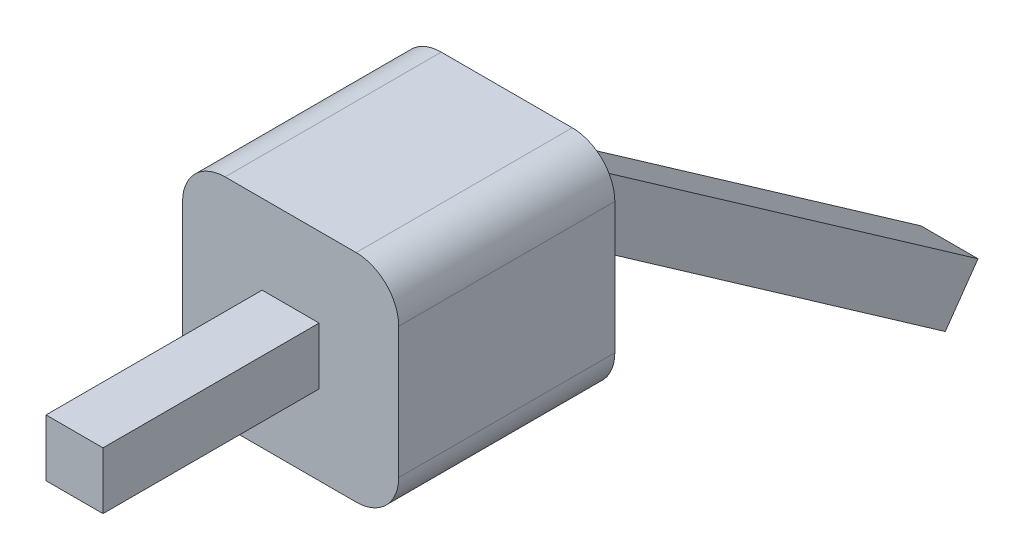
ISO-10303-21;
HEADER;
FILE_DESCRIPTION(('STEP AP214'),'2;1');
FILE_NAME('part.step','',(''),(''),'','','');
FILE_SCHEMA(('AUTOMOTIVE_DESIGN { 1 0 10303 214 1 1 1 1 }'));
ENDSEC;
DATA;
#1=APPLICATION_CONTEXT('core data for automotive mechanical design processes');
#2=APPLICATION_PROTOCOL_DEFINITION('international standard','automotive_design',2000,#1);
#3=PRODUCT_CONTEXT('',#1,'mechanical');
#4=PRODUCT('Part','Part','',(#3));
#5=PRODUCT_RELATED_PRODUCT_CATEGORY('part','',(#4));
#6=PRODUCT_DEFINITION_FORMATION('','',#4);
#7=PRODUCT_DEFINITION_CONTEXT('part definition',#1,'design');
#8=PRODUCT_DEFINITION('design','',#6,#7);
#9=PRODUCT_DEFINITION_SHAPE('','',#8);
#10=(LENGTH_UNIT() NAMED_UNIT(*) SI_UNIT(.MILLI.,.METRE.));
#11=(NAMED_UNIT(*) PLANE_ANGLE_UNIT() SI_UNIT($,.RADIAN.));
#12=(NAMED_UNIT(*) SI_UNIT($,.STERADIAN.) SOLID_ANGLE_UNIT());
#13=UNCERTAINTY_MEASURE_WITH_UNIT(LENGTH_MEASURE(1.E-05),#10,'distance_accuracy_value','');
#14=(GEOMETRIC_REPRESENTATION_CONTEXT(3) GLOBAL_UNCERTAINTY_ASSIGNED_CONTEXT((#13)) GLOBAL_UNIT_ASSIGNED_CONTEXT((#10,
#11,#12)) REPRESENTATION_CONTEXT('',''));
#15=CARTESIAN_POINT('',(0.,0.,0.));
#16=DIRECTION('',(0.,0.,1.));
#17=DIRECTION('',(1.,0.,0.));
#18=AXIS2_PLACEMENT_3D('',#15,#16,#17);
#19=CARTESIAN_POINT('',(-1.27,-0.0190907262086213,2.54));
#20=DIRECTION('',(0.,0.,1.));
#21=DIRECTION('',(1.,0.,0.));
#22=AXIS2_PLACEMENT_3D('',#19,#20,#21);
#23=PLANE('',#22);
#24=DIRECTION('',(1.,0.,0.));
#25=VECTOR('',#24,1.);
#26=CARTESIAN_POINT('',(-1.27,-2.55909072620862,2.54));
#27=LINE('',#26,#25);
#28=CARTESIAN_POINT('',(-0.769999999999999,-2.55909072620862,2.54));
#29=VERTEX_POINT('',#28);
#30=CARTESIAN_POINT('',(0.770000000000001,-2.55909072620862,2.54));
#31=VERTEX_POINT('',#30);
#32=EDGE_CURVE('E247',#29,#31,#27,.T.);
#33=ORIENTED_EDGE('',*,*,#32,.T.);
#34=CARTESIAN_POINT('',(0.770000000000001,-2.05909072620862,2.54));
#35=DIRECTION('',(0.,0.,1.));
#36=DIRECTION('',(1.,0.,0.));
#37=AXIS2_PLACEMENT_3D('',#34,#35,#36);
#38=CIRCLE('',#37,0.5);
#39=CARTESIAN_POINT('',(1.27,-2.05909072620862,2.54));
#40=VERTEX_POINT('',#39);
#41=EDGE_CURVE('E289',#31,#40,#38,.T.);
#42=ORIENTED_EDGE('',*,*,#41,.T.);
#43=DIRECTION('',(0.,1.,0.));
#44=VECTOR('',#43,1.);
#45=CARTESIAN_POINT('',(1.27,-0.019090726208621,2.54));
#46=LINE('',#45,#44);
#47=CARTESIAN_POINT('',(1.27,-0.519090726208621,2.54));
#48=VERTEX_POINT('',#47);
#49=EDGE_CURVE('E250',#40,#48,#46,.T.);
#50=ORIENTED_EDGE('',*,*,#49,.T.);
#51=CARTESIAN_POINT('',(0.770000000000001,-0.519090726208621,2.54));
#52=DIRECTION('',(0.,0.,1.));
#53=DIRECTION('',(1.,0.,0.));
#54=AXIS2_PLACEMENT_3D('',#51,#52,#53);
#55=CIRCLE('',#54,0.5);
#56=CARTESIAN_POINT('',(0.770000000000001,-0.019090726208621,2.54));
#57=VERTEX_POINT('',#56);
#58=EDGE_CURVE('E56',#48,#57,#55,.T.);
#59=ORIENTED_EDGE('',*,*,#58,.T.);
#60=DIRECTION('',(-1.,0.,0.));
#61=VECTOR('',#60,1.);
#62=CARTESIAN_POINT('',(-1.27,-0.0190907262086213,2.54));
#63=LINE('',#62,#61);
#64=CARTESIAN_POINT('',(-0.77,-0.0190907262086212,2.54));
#65=VERTEX_POINT('',#64);
#66=EDGE_CURVE('E252',#57,#65,#63,.T.);
#67=ORIENTED_EDGE('',*,*,#66,.T.);
#68=CARTESIAN_POINT('',(-0.769999999999999,-0.519090726208621,2.54));
#69=DIRECTION('',(0.,0.,1.));
#70=DIRECTION('',(1.,0.,0.));
#71=AXIS2_PLACEMENT_3D('',#68,#69,#70);
#72=CIRCLE('',#71,0.5);
#73=CARTESIAN_POINT('',(-1.27,-0.519090726208621,2.54));
#74=VERTEX_POINT('',#73);
#75=EDGE_CURVE('E285',#65,#74,#72,.T.);
#76=ORIENTED_EDGE('',*,*,#75,.T.);
#77=DIRECTION('',(0.,-1.,0.));
#78=VECTOR('',#77,1.);
#79=CARTESIAN_POINT('',(-1.27,-0.0190907262086213,2.54));
#80=LINE('',#79,#78);
#81=CARTESIAN_POINT('',(-1.27,-2.05909072620862,2.54));
#82=VERTEX_POINT('',#81);
#83=EDGE_CURVE('E244',#74,#82,#80,.T.);
#84=ORIENTED_EDGE('',*,*,#83,.T.);
#85=CARTESIAN_POINT('',(-0.769999999999999,-2.05909072620862,2.54));
#86=DIRECTION('',(0.,0.,1.));
#87=DIRECTION('',(1.,0.,0.));
#88=AXIS2_PLACEMENT_3D('',#85,#86,#87);
#89=CIRCLE('',#88,0.5);
#90=EDGE_CURVE('E287',#82,#29,#89,.T.);
#91=ORIENTED_EDGE('',*,*,#90,.T.);
#92=EDGE_LOOP('',(#33,#42,#50,#59,#67,#76,#84,#91));
#93=FACE_BOUND('',#92,.T.);
#94=DIRECTION('',(0.,1.,0.));
#95=VECTOR('',#94,1.);
#96=CARTESIAN_POINT('',(-0.335,-0.0190907262086213,2.54));
#97=LINE('',#96,#95);
#98=CARTESIAN_POINT('',(-0.335,-1.62409072620862,2.54));
#99=VERTEX_POINT('',#98);
#100=CARTESIAN_POINT('',(-0.335,-0.954090726208622,2.54));
#101=VERTEX_POINT('',#100);
#102=EDGE_CURVE('E227',#99,#101,#97,.T.);
#103=ORIENTED_EDGE('',*,*,#102,.T.);
#104=DIRECTION('',(1.,0.,0.));
#105=VECTOR('',#104,1.);
#106=CARTESIAN_POINT('',(-1.27,-0.954090726208621,2.54));
#107=LINE('',#106,#105);
#108=CARTESIAN_POINT('',(0.335,-0.954090726208622,2.54));
#109=VERTEX_POINT('',#108);
#110=EDGE_CURVE('E230',#101,#109,#107,.T.);
#111=ORIENTED_EDGE('',*,*,#110,.T.);
#112=DIRECTION('',(0.,-1.,0.));
#113=VECTOR('',#112,1.);
#114=CARTESIAN_POINT('',(0.335000000000001,-0.0190907262086233,2.54));
#115=LINE('',#114,#113);
#116=CARTESIAN_POINT('',(0.334999999999999,-1.62409072620862,2.54));
#117=VERTEX_POINT('',#116);
#118=EDGE_CURVE('E223',#109,#117,#115,.T.);
#119=ORIENTED_EDGE('',*,*,#118,.T.);
#120=DIRECTION('',(-1.,0.,0.));
#121=VECTOR('',#120,1.);
#122=CARTESIAN_POINT('',(-1.27,-1.62409072620862,2.54));
#123=LINE('',#122,#121);
#124=EDGE_CURVE('E168',#117,#99,#123,.T.);
#125=ORIENTED_EDGE('',*,*,#124,.T.);
#126=EDGE_LOOP('',(#103,#111,#119,#125));
#127=FACE_BOUND('',#126,.T.);
#128=ADVANCED_FACE('F36',(#93,#127),#23,.T.);
#129=CARTESIAN_POINT('',(-1.27,-0.0190907262086213,0.));
#130=DIRECTION('',(0.,0.,1.));
#131=DIRECTION('',(1.,0.,0.));
#132=AXIS2_PLACEMENT_3D('',#129,#130,#131);
#133=PLANE('',#132);
#134=DIRECTION('',(0.,1.,0.));
#135=VECTOR('',#134,1.);
#136=CARTESIAN_POINT('',(1.27,-0.019090726208621,0.));
#137=LINE('',#136,#135);
#138=CARTESIAN_POINT('',(1.27,-2.05909072620862,0.));
#139=VERTEX_POINT('',#138);
#140=CARTESIAN_POINT('',(1.27,-0.519090726208621,0.));
#141=VERTEX_POINT('',#140);
#142=EDGE_CURVE('E239',#139,#141,#137,.T.);
#143=ORIENTED_EDGE('',*,*,#142,.F.);
#144=CARTESIAN_POINT('',(0.770000000000001,-2.05909072620862,0.));
#145=DIRECTION('',(0.,0.,1.));
#146=DIRECTION('',(1.,0.,0.));
#147=AXIS2_PLACEMENT_3D('',#144,#145,#146);
#148=CIRCLE('',#147,0.5);
#149=CARTESIAN_POINT('',(0.770000000000001,-2.55909072620862,0.));
#150=VERTEX_POINT('',#149);
#151=EDGE_CURVE('E277',#139,#150,#148,.F.);
#152=ORIENTED_EDGE('',*,*,#151,.T.);
#153=DIRECTION('',(1.,0.,0.));
#154=VECTOR('',#153,1.);
#155=CARTESIAN_POINT('',(-1.27,-2.55909072620862,0.));
#156=LINE('',#155,#154);
#157=CARTESIAN_POINT('',(-0.769999999999999,-2.55909072620862,0.));
#158=VERTEX_POINT('',#157);
#159=EDGE_CURVE('E236',#158,#150,#156,.T.);
#160=ORIENTED_EDGE('',*,*,#159,.F.);
#161=CARTESIAN_POINT('',(-0.769999999999999,-2.05909072620862,0.));
#162=DIRECTION('',(0.,0.,1.));
#163=DIRECTION('',(1.,0.,0.));
#164=AXIS2_PLACEMENT_3D('',#161,#162,#163);
#165=CIRCLE('',#164,0.5);
#166=CARTESIAN_POINT('',(-1.27,-2.05909072620862,0.));
#167=VERTEX_POINT('',#166);
#168=EDGE_CURVE('E275',#158,#167,#165,.F.);
#169=ORIENTED_EDGE('',*,*,#168,.T.);
#170=DIRECTION('',(0.,-1.,0.));
#171=VECTOR('',#170,1.);
#172=CARTESIAN_POINT('',(-1.27,-0.0190907262086213,0.));
#173=LINE('',#172,#171);
#174=CARTESIAN_POINT('',(-1.27,-0.519090726208621,0.));
#175=VERTEX_POINT('',#174);
#176=EDGE_CURVE('E233',#175,#167,#173,.T.);
#177=ORIENTED_EDGE('',*,*,#176,.F.);
#178=CARTESIAN_POINT('',(-0.769999999999999,-0.519090726208621,0.));
#179=DIRECTION('',(0.,0.,1.));
#180=DIRECTION('',(1.,0.,0.));
#181=AXIS2_PLACEMENT_3D('',#178,#179,#180);
#182=CIRCLE('',#181,0.5);
#183=CARTESIAN_POINT('',(-0.77,-0.0190907262086212,0.));
#184=VERTEX_POINT('',#183);
#185=EDGE_CURVE('E273',#175,#184,#182,.F.);
#186=ORIENTED_EDGE('',*,*,#185,.T.);
#187=DIRECTION('',(-1.,0.,0.));
#188=VECTOR('',#187,1.);
#189=CARTESIAN_POINT('',(-1.27,-0.0190907262086213,0.));
#190=LINE('',#189,#188);
#191=CARTESIAN_POINT('',(0.770000000000001,-0.019090726208621,0.));
#192=VERTEX_POINT('',#191);
#193=EDGE_CURVE('E242',#192,#184,#190,.T.);
#194=ORIENTED_EDGE('',*,*,#193,.F.);
#195=CARTESIAN_POINT('',(0.770000000000001,-0.519090726208621,0.));
#196=DIRECTION('',(0.,0.,1.));
#197=DIRECTION('',(1.,0.,0.));
#198=AXIS2_PLACEMENT_3D('',#195,#196,#197);
#199=CIRCLE('',#198,0.5);
#200=EDGE_CURVE('E271',#192,#141,#199,.F.);
#201=ORIENTED_EDGE('',*,*,#200,.T.);
#202=EDGE_LOOP('',(#143,#152,#160,#169,#177,#186,#194,#201));
#203=FACE_BOUND('',#202,.T.);
#204=DIRECTION('',(1.,0.,0.));
#205=VECTOR('',#204,1.);
#206=CARTESIAN_POINT('',(-1.27,-0.954090726208621,0.));
#207=LINE('',#206,#205);
#208=CARTESIAN_POINT('',(-0.335,-0.954090726208621,0.));
#209=VERTEX_POINT('',#208);
#210=CARTESIAN_POINT('',(0.335,-0.954090726208622,0.));
#211=VERTEX_POINT('',#210);
#212=EDGE_CURVE('E263',#209,#211,#207,.T.);
#213=ORIENTED_EDGE('',*,*,#212,.F.);
#214=DIRECTION('',(0.,1.,0.));
#215=VECTOR('',#214,1.);
#216=CARTESIAN_POINT('',(-0.335,-0.0190907262086213,0.));
#217=LINE('',#216,#215);
#218=CARTESIAN_POINT('',(-0.335,-1.62409072620862,0.));
#219=VERTEX_POINT('',#218);
#220=EDGE_CURVE('E260',#219,#209,#217,.T.);
#221=ORIENTED_EDGE('',*,*,#220,.F.);
#222=DIRECTION('',(-1.,0.,0.));
#223=VECTOR('',#222,1.);
#224=CARTESIAN_POINT('',(-1.27,-1.62409072620862,0.));
#225=LINE('',#224,#223);
#226=CARTESIAN_POINT('',(0.334999999999999,-1.62409072620862,0.));
#227=VERTEX_POINT('',#226);
#228=EDGE_CURVE('E257',#227,#219,#225,.T.);
#229=ORIENTED_EDGE('',*,*,#228,.F.);
#230=DIRECTION('',(0.,-1.,0.));
#231=VECTOR('',#230,1.);
#232=CARTESIAN_POINT('',(0.335000000000001,-0.0190907262086233,0.));
#233=LINE('',#232,#231);
#234=EDGE_CURVE('E254',#211,#227,#233,.T.);
#235=ORIENTED_EDGE('',*,*,#234,.F.);
#236=EDGE_LOOP('',(#213,#221,#229,#235));
#237=FACE_BOUND('',#236,.T.);
#238=ADVANCED_FACE('F302',(#203,#237),#133,.F.);
#239=CARTESIAN_POINT('',(-1.27,-0.0190907262086213,2.54));
#240=DIRECTION('',(1.,0.,0.));
#241=DIRECTION('',(0.,0.,-1.));
#242=AXIS2_PLACEMENT_3D('',#239,#240,#241);
#243=PLANE('',#242);
#244=ORIENTED_EDGE('',*,*,#176,.T.);
#245=DIRECTION('',(0.,0.,-1.));
#246=VECTOR('',#245,1.);
#247=CARTESIAN_POINT('',(-1.27,-2.05909072620862,2.54));
#248=LINE('',#247,#246);
#249=EDGE_CURVE('E294',#167,#82,#248,.F.);
#250=ORIENTED_EDGE('',*,*,#249,.T.);
#251=ORIENTED_EDGE('',*,*,#83,.F.);
#252=DIRECTION('',(0.,0.,-1.));
#253=VECTOR('',#252,1.);
#254=CARTESIAN_POINT('',(-1.27,-0.519090726208621,2.54));
#255=LINE('',#254,#253);
#256=EDGE_CURVE('E291',#74,#175,#255,.T.);
#257=ORIENTED_EDGE('',*,*,#256,.T.);
#258=EDGE_LOOP('',(#244,#250,#251,#257));
#259=FACE_BOUND('',#258,.T.);
#260=ADVANCED_FACE('F311',(#259),#243,.F.);
#261=CARTESIAN_POINT('',(-1.27,-2.55909072620862,2.54));
#262=DIRECTION('',(0.,1.,0.));
#263=DIRECTION('',(-1.,0.,0.));
#264=AXIS2_PLACEMENT_3D('',#261,#262,#263);
#265=PLANE('',#264);
#266=ORIENTED_EDGE('',*,*,#159,.T.);
#267=DIRECTION('',(0.,0.,-1.));
#268=VECTOR('',#267,1.);
#269=CARTESIAN_POINT('',(0.770000000000001,-2.55909072620862,2.54));
#270=LINE('',#269,#268);
#271=EDGE_CURVE('E282',#150,#31,#270,.F.);
#272=ORIENTED_EDGE('',*,*,#271,.T.);
#273=ORIENTED_EDGE('',*,*,#32,.F.);
#274=DIRECTION('',(0.,0.,-1.));
#275=VECTOR('',#274,1.);
#276=CARTESIAN_POINT('',(-0.769999999999999,-2.55909072620862,2.54));
#277=LINE('',#276,#275);
#278=EDGE_CURVE('E279',#29,#158,#277,.T.);
#279=ORIENTED_EDGE('',*,*,#278,.T.);
#280=EDGE_LOOP('',(#266,#272,#273,#279));
#281=FACE_BOUND('',#280,.T.);
#282=ADVANCED_FACE('F321',(#281),#265,.F.);
#283=CARTESIAN_POINT('',(1.27,-0.019090726208621,2.54));
#284=DIRECTION('',(-1.,0.,0.));
#285=DIRECTION('',(0.,0.,1.));
#286=AXIS2_PLACEMENT_3D('',#283,#284,#285);
#287=PLANE('',#286);
#288=ORIENTED_EDGE('',*,*,#49,.F.);
#289=DIRECTION('',(0.,0.,-1.));
#290=VECTOR('',#289,1.);
#291=CARTESIAN_POINT('',(1.27,-2.05909072620862,2.54));
#292=LINE('',#291,#290);
#293=EDGE_CURVE('E268',#40,#139,#292,.T.);
#294=ORIENTED_EDGE('',*,*,#293,.T.);
#295=ORIENTED_EDGE('',*,*,#142,.T.);
#296=DIRECTION('',(0.,0.,-1.));
#297=VECTOR('',#296,1.);
#298=CARTESIAN_POINT('',(1.27,-0.519090726208621,2.54));
#299=LINE('',#298,#297);
#300=EDGE_CURVE('E266',#141,#48,#299,.F.);
#301=ORIENTED_EDGE('',*,*,#300,.T.);
#302=EDGE_LOOP('',(#288,#294,#295,#301));
#303=FACE_BOUND('',#302,.T.);
#304=ADVANCED_FACE('F329',(#303),#287,.F.);
#305=CARTESIAN_POINT('',(-1.27,-0.0190907262086213,2.54));
#306=DIRECTION('',(0.,-1.,0.));
#307=DIRECTION('',(1.,0.,0.));
#308=AXIS2_PLACEMENT_3D('',#305,#306,#307);
#309=PLANE('',#308);
#310=ORIENTED_EDGE('',*,*,#193,.T.);
#311=DIRECTION('',(0.,0.,-1.));
#312=VECTOR('',#311,1.);
#313=CARTESIAN_POINT('',(-0.77,-0.0190907262086212,2.54));
#314=LINE('',#313,#312);
#315=EDGE_CURVE('E12',#184,#65,#314,.F.);
#316=ORIENTED_EDGE('',*,*,#315,.T.);
#317=ORIENTED_EDGE('',*,*,#66,.F.);
#318=DIRECTION('',(0.,0.,-1.));
#319=VECTOR('',#318,1.);
#320=CARTESIAN_POINT('',(0.770000000000001,-0.019090726208621,2.54));
#321=LINE('',#320,#319);
#322=EDGE_CURVE('E44',#57,#192,#321,.T.);
#323=ORIENTED_EDGE('',*,*,#322,.T.);
#324=EDGE_LOOP('',(#310,#316,#317,#323));
#325=FACE_BOUND('',#324,.T.);
#326=ADVANCED_FACE('F298',(#325),#309,.F.);
#327=CARTESIAN_POINT('',(0.335,-0.954090726208622,-0.608778082163248));
#328=DIRECTION('',(0.,0.819152044288995,-0.573576436351041));
#329=DIRECTION('',(0.,0.573576436351041,0.819152044288995));
#330=AXIS2_PLACEMENT_3D('',#327,#328,#329);
#331=PLANE('',#330);
#332=DIRECTION('',(0.,-0.573576436351041,-0.819152044288995));
#333=VECTOR('',#332,1.);
#334=CARTESIAN_POINT('',(0.335,-0.954090726208622,-0.608778082163248));
#335=LINE('',#334,#333);
#336=CARTESIAN_POINT('',(0.335,-0.954090726208622,-0.608778082163248));
#337=VERTEX_POINT('',#336);
#338=CARTESIAN_POINT('',(0.335,-4.17115367085964,-5.20322011413058));
#339=VERTEX_POINT('',#338);
#340=EDGE_CURVE('E216',#337,#339,#335,.T.);
#341=ORIENTED_EDGE('',*,*,#340,.T.);
#342=DIRECTION('',(-1.,0.,0.));
#343=VECTOR('',#342,1.);
#344=CARTESIAN_POINT('',(0.335,-4.17115367085964,-5.20322011413058));
#345=LINE('',#344,#343);
#346=CARTESIAN_POINT('',(-0.335,-4.17115367085964,-5.20322011413058));
#347=VERTEX_POINT('',#346);
#348=EDGE_CURVE('E222',#339,#347,#345,.T.);
#349=ORIENTED_EDGE('',*,*,#348,.T.);
#350=DIRECTION('',(0.,-0.573576436351041,-0.819152044288995));
#351=VECTOR('',#350,1.);
#352=CARTESIAN_POINT('',(-0.335,-0.954090726208621,-0.608778082163248));
#353=LINE('',#352,#351);
#354=CARTESIAN_POINT('',(-0.335,-0.954090726208621,-0.608778082163248));
#355=VERTEX_POINT('',#354);
#356=EDGE_CURVE('E207',#355,#347,#353,.T.);
#357=ORIENTED_EDGE('',*,*,#356,.F.);
#358=DIRECTION('',(1.,0.,0.));
#359=VECTOR('',#358,1.);
#360=CARTESIAN_POINT('',(0.335,-0.954090726208622,-0.608778082163248));
#361=LINE('',#360,#359);
#362=EDGE_CURVE('E189',#355,#337,#361,.T.);
#363=ORIENTED_EDGE('',*,*,#362,.T.);
#364=EDGE_LOOP('',(#341,#349,#357,#363));
#365=FACE_BOUND('',#364,.T.);
#366=ADVANCED_FACE('F345',(#365),#331,.T.);
#367=CARTESIAN_POINT('',(0.,-4.44556960569646,-5.01107200795298));
#368=DIRECTION('',(0.,-0.573576436351041,-0.819152044288995));
#369=DIRECTION('',(0.,0.819152044288995,-0.573576436351041));
#370=AXIS2_PLACEMENT_3D('',#367,#368,#369);
#371=PLANE('',#370);
#372=DIRECTION('',(0.,0.819152044288995,-0.573576436351041));
#373=VECTOR('',#372,1.);
#374=CARTESIAN_POINT('',(0.335,-3.97337233810432,-5.34170809424302));
#375=LINE('',#374,#373);
#376=CARTESIAN_POINT('',(0.334999999999999,-4.71998554053327,-4.81892390177538));
#377=VERTEX_POINT('',#376);
#378=EDGE_CURVE('E219',#377,#339,#375,.T.);
#379=ORIENTED_EDGE('',*,*,#378,.F.);
#380=DIRECTION('',(1.,0.,0.));
#381=VECTOR('',#380,1.);
#382=CARTESIAN_POINT('',(0.334999999999999,-4.71998554053327,-4.81892390177538));
#383=LINE('',#382,#381);
#384=CARTESIAN_POINT('',(-0.335,-4.71998554053327,-4.81892390177538));
#385=VERTEX_POINT('',#384);
#386=EDGE_CURVE('E225',#385,#377,#383,.T.);
#387=ORIENTED_EDGE('',*,*,#386,.F.);
#388=DIRECTION('',(0.,-0.819152044288995,0.573576436351041));
#389=VECTOR('',#388,1.);
#390=CARTESIAN_POINT('',(-0.335,-3.97337233810432,-5.34170809424302));
#391=LINE('',#390,#389);
#392=EDGE_CURVE('E533',#347,#385,#391,.T.);
#393=ORIENTED_EDGE('',*,*,#392,.F.);
#394=ORIENTED_EDGE('',*,*,#348,.F.);
#395=EDGE_LOOP('',(#379,#387,#393,#394));
#396=FACE_BOUND('',#395,.T.);
#397=ADVANCED_FACE('F469',(#396),#371,.T.);
#398=CARTESIAN_POINT('',(0.334999999999999,-1.62409072620862,-0.397527893614331));
#399=DIRECTION('',(0.,-0.819152044288995,0.573576436351041));
#400=DIRECTION('',(0.,-0.573576436351041,-0.819152044288995));
#401=AXIS2_PLACEMENT_3D('',#398,#399,#400);
#402=PLANE('',#401);
#403=DIRECTION('',(0.,-0.573576436351041,-0.819152044288995));
#404=VECTOR('',#403,1.);
#405=CARTESIAN_POINT('',(-0.335,-1.62409072620862,-0.397527893614331));
#406=LINE('',#405,#404);
#407=CARTESIAN_POINT('',(-0.335,-1.62409072620862,-0.397527893614331));
#408=VERTEX_POINT('',#407);
#409=EDGE_CURVE('E210',#408,#385,#406,.T.);
#410=ORIENTED_EDGE('',*,*,#409,.T.);
#411=ORIENTED_EDGE('',*,*,#386,.T.);
#412=DIRECTION('',(0.,-0.573576436351041,-0.819152044288995));
#413=VECTOR('',#412,1.);
#414=CARTESIAN_POINT('',(0.334999999999999,-1.62409072620862,-0.397527893614331));
#415=LINE('',#414,#413);
#416=CARTESIAN_POINT('',(0.334999999999999,-1.62409072620862,-0.397527893614331));
#417=VERTEX_POINT('',#416);
#418=EDGE_CURVE('E213',#417,#377,#415,.T.);
#419=ORIENTED_EDGE('',*,*,#418,.F.);
#420=DIRECTION('',(-1.,0.,0.));
#421=VECTOR('',#420,1.);
#422=CARTESIAN_POINT('',(0.334999999999999,-1.62409072620862,-0.397527893614331));
#423=LINE('',#422,#421);
#424=EDGE_CURVE('E206',#417,#408,#423,.T.);
#425=ORIENTED_EDGE('',*,*,#424,.T.);
#426=EDGE_LOOP('',(#410,#411,#419,#425));
#427=FACE_BOUND('',#426,.T.);
#428=ADVANCED_FACE('F459',(#427),#402,.T.);
#429=CARTESIAN_POINT('',(0.335,-0.954090726208622,-1.45067607467876));
#430=DIRECTION('',(-1.,0.,0.));
#431=DIRECTION('',(0.,-1.,0.));
#432=AXIS2_PLACEMENT_3D('',#429,#430,#431);
#433=PLANE('',#432);
#434=DIRECTION('',(0.,0.,1.));
#435=VECTOR('',#434,1.);
#436=CARTESIAN_POINT('',(0.335,-0.954090726208622,-1.45067607467876));
#437=LINE('',#436,#435);
#438=EDGE_CURVE('E195',#337,#211,#437,.T.);
#439=ORIENTED_EDGE('',*,*,#438,.T.);
#440=ORIENTED_EDGE('',*,*,#234,.T.);
#441=DIRECTION('',(0.,0.,1.));
#442=VECTOR('',#441,1.);
#443=CARTESIAN_POINT('',(0.334999999999999,-1.62409072620862,-1.45067607467876));
#444=LINE('',#443,#442);
#445=EDGE_CURVE('E172',#417,#227,#444,.T.);
#446=ORIENTED_EDGE('',*,*,#445,.F.);
#447=ORIENTED_EDGE('',*,*,#418,.T.);
#448=ORIENTED_EDGE('',*,*,#378,.T.);
#449=ORIENTED_EDGE('',*,*,#340,.F.);
#450=EDGE_LOOP('',(#439,#440,#446,#447,#448,#449));
#451=FACE_BOUND('',#450,.T.);
#452=ADVANCED_FACE('F392',(#451),#433,.F.);
#453=CARTESIAN_POINT('',(0.334999999999999,-1.62409072620862,-1.45067607467876));
#454=DIRECTION('',(0.,1.,0.));
#455=DIRECTION('',(0.,0.,1.));
#456=AXIS2_PLACEMENT_3D('',#453,#454,#455);
#457=PLANE('',#456);
#458=ORIENTED_EDGE('',*,*,#445,.T.);
#459=ORIENTED_EDGE('',*,*,#228,.T.);
#460=DIRECTION('',(0.,0.,1.));
#461=VECTOR('',#460,1.);
#462=CARTESIAN_POINT('',(-0.335,-1.62409072620862,-1.45067607467876));
#463=LINE('',#462,#461);
#464=EDGE_CURVE('E173',#408,#219,#463,.T.);
#465=ORIENTED_EDGE('',*,*,#464,.F.);
#466=ORIENTED_EDGE('',*,*,#424,.F.);
#467=EDGE_LOOP('',(#458,#459,#465,#466));
#468=FACE_BOUND('',#467,.T.);
#469=ADVANCED_FACE('F404',(#468),#457,.F.);
#470=CARTESIAN_POINT('',(-0.335,-0.954090726208622,-1.45067607467876));
#471=DIRECTION('',(1.,0.,0.));
#472=DIRECTION('',(0.,0.,-1.));
#473=AXIS2_PLACEMENT_3D('',#470,#471,#472);
#474=PLANE('',#473);
#475=ORIENTED_EDGE('',*,*,#464,.T.);
#476=ORIENTED_EDGE('',*,*,#220,.T.);
#477=DIRECTION('',(0.,0.,1.));
#478=VECTOR('',#477,1.);
#479=CARTESIAN_POINT('',(-0.335,-0.954090726208622,-1.45067607467876));
#480=LINE('',#479,#478);
#481=EDGE_CURVE('E199',#355,#209,#480,.T.);
#482=ORIENTED_EDGE('',*,*,#481,.F.);
#483=ORIENTED_EDGE('',*,*,#356,.T.);
#484=ORIENTED_EDGE('',*,*,#392,.T.);
#485=ORIENTED_EDGE('',*,*,#409,.F.);
#486=EDGE_LOOP('',(#475,#476,#482,#483,#484,#485));
#487=FACE_BOUND('',#486,.T.);
#488=ADVANCED_FACE('F415',(#487),#474,.F.);
#489=CARTESIAN_POINT('',(0.335,-0.954090726208622,-1.45067607467876));
#490=DIRECTION('',(0.,-1.,0.));
#491=DIRECTION('',(1.,0.,0.));
#492=AXIS2_PLACEMENT_3D('',#489,#490,#491);
#493=PLANE('',#492);
#494=ORIENTED_EDGE('',*,*,#481,.T.);
#495=ORIENTED_EDGE('',*,*,#212,.T.);
#496=ORIENTED_EDGE('',*,*,#438,.F.);
#497=ORIENTED_EDGE('',*,*,#362,.F.);
#498=EDGE_LOOP('',(#494,#495,#496,#497));
#499=FACE_BOUND('',#498,.T.);
#500=ADVANCED_FACE('F424',(#499),#493,.F.);
#501=ORIENTED_EDGE('',*,*,#110,.F.);
#502=CARTESIAN_POINT('',(-0.335,-0.954090726208621,5.08));
#503=VERTEX_POINT('',#502);
#504=EDGE_CURVE('E198',#101,#503,#480,.T.);
#505=ORIENTED_EDGE('',*,*,#504,.T.);
#506=DIRECTION('',(1.,0.,0.));
#507=VECTOR('',#506,1.);
#508=CARTESIAN_POINT('',(0.335,-0.954090726208622,5.08));
#509=LINE('',#508,#507);
#510=CARTESIAN_POINT('',(0.335,-0.954090726208622,5.08));
#511=VERTEX_POINT('',#510);
#512=EDGE_CURVE('E193',#503,#511,#509,.T.);
#513=ORIENTED_EDGE('',*,*,#512,.T.);
#514=EDGE_CURVE('E185',#109,#511,#437,.T.);
#515=ORIENTED_EDGE('',*,*,#514,.F.);
#516=EDGE_LOOP('',(#501,#505,#513,#515));
#517=FACE_BOUND('',#516,.T.);
#518=ADVANCED_FACE('F412',(#517),#493,.F.);
#519=ORIENTED_EDGE('',*,*,#102,.F.);
#520=CARTESIAN_POINT('',(-0.335,-1.62409072620862,5.08));
#521=VERTEX_POINT('',#520);
#522=EDGE_CURVE('E202',#99,#521,#463,.T.);
#523=ORIENTED_EDGE('',*,*,#522,.T.);
#524=DIRECTION('',(0.,1.,0.));
#525=VECTOR('',#524,1.);
#526=CARTESIAN_POINT('',(-0.335,-0.954090726208621,5.08));
#527=LINE('',#526,#525);
#528=EDGE_CURVE('E181',#521,#503,#527,.T.);
#529=ORIENTED_EDGE('',*,*,#528,.T.);
#530=ORIENTED_EDGE('',*,*,#504,.F.);
#531=EDGE_LOOP('',(#519,#523,#529,#530));
#532=FACE_BOUND('',#531,.T.);
#533=ADVANCED_FACE('F402',(#532),#474,.F.);
#534=ORIENTED_EDGE('',*,*,#124,.F.);
#535=CARTESIAN_POINT('',(0.334999999999999,-1.62409072620862,5.08));
#536=VERTEX_POINT('',#535);
#537=EDGE_CURVE('E161',#117,#536,#444,.T.);
#538=ORIENTED_EDGE('',*,*,#537,.T.);
#539=DIRECTION('',(-1.,0.,0.));
#540=VECTOR('',#539,1.);
#541=CARTESIAN_POINT('',(0.334999999999999,-1.62409072620862,5.08));
#542=LINE('',#541,#540);
#543=EDGE_CURVE('E165',#536,#521,#542,.T.);
#544=ORIENTED_EDGE('',*,*,#543,.T.);
#545=ORIENTED_EDGE('',*,*,#522,.F.);
#546=EDGE_LOOP('',(#534,#538,#544,#545));
#547=FACE_BOUND('',#546,.T.);
#548=ADVANCED_FACE('F163',(#547),#457,.F.);
#549=ORIENTED_EDGE('',*,*,#118,.F.);
#550=ORIENTED_EDGE('',*,*,#514,.T.);
#551=DIRECTION('',(0.,-1.,0.));
#552=VECTOR('',#551,1.);
#553=CARTESIAN_POINT('',(0.335,-0.954090726208622,5.08));
#554=LINE('',#553,#552);
#555=EDGE_CURVE('E179',#511,#536,#554,.T.);
#556=ORIENTED_EDGE('',*,*,#555,.T.);
#557=ORIENTED_EDGE('',*,*,#537,.F.);
#558=EDGE_LOOP('',(#549,#550,#556,#557));
#559=FACE_BOUND('',#558,.T.);
#560=ADVANCED_FACE('F183',(#559),#433,.F.);
#561=CARTESIAN_POINT('',(0.335,-0.954090726208622,5.08));
#562=DIRECTION('',(0.,0.,-1.));
#563=DIRECTION('',(-1.,0.,0.));
#564=AXIS2_PLACEMENT_3D('',#561,#562,#563);
#565=PLANE('',#564);
#566=ORIENTED_EDGE('',*,*,#555,.F.);
#567=ORIENTED_EDGE('',*,*,#512,.F.);
#568=ORIENTED_EDGE('',*,*,#528,.F.);
#569=ORIENTED_EDGE('',*,*,#543,.F.);
#570=EDGE_LOOP('',(#566,#567,#568,#569));
#571=FACE_BOUND('',#570,.T.);
#572=ADVANCED_FACE('F177',(#571),#565,.F.);
#573=CARTESIAN_POINT('',(0.770000000000001,-2.05909072620862,2.54));
#574=DIRECTION('',(0.,0.,-1.));
#575=DIRECTION('',(-1.,0.,0.));
#576=AXIS2_PLACEMENT_3D('',#573,#574,#575);
#577=CYLINDRICAL_SURFACE('',#576,0.5);
#578=ORIENTED_EDGE('',*,*,#41,.F.);
#579=ORIENTED_EDGE('',*,*,#271,.F.);
#580=ORIENTED_EDGE('',*,*,#151,.F.);
#581=ORIENTED_EDGE('',*,*,#293,.F.);
#582=EDGE_LOOP('',(#578,#579,#580,#581));
#583=FACE_BOUND('',#582,.T.);
#584=ADVANCED_FACE('F326',(#583),#577,.T.);
#585=CARTESIAN_POINT('',(-0.769999999999999,-2.05909072620862,2.54));
#586=DIRECTION('',(0.,0.,-1.));
#587=DIRECTION('',(-1.,0.,0.));
#588=AXIS2_PLACEMENT_3D('',#585,#586,#587);
#589=CYLINDRICAL_SURFACE('',#588,0.5);
#590=ORIENTED_EDGE('',*,*,#90,.F.);
#591=ORIENTED_EDGE('',*,*,#249,.F.);
#592=ORIENTED_EDGE('',*,*,#168,.F.);
#593=ORIENTED_EDGE('',*,*,#278,.F.);
#594=EDGE_LOOP('',(#590,#591,#592,#593));
#595=FACE_BOUND('',#594,.T.);
#596=ADVANCED_FACE('F318',(#595),#589,.T.);
#597=CARTESIAN_POINT('',(-0.769999999999999,-0.519090726208621,2.54));
#598=DIRECTION('',(0.,0.,-1.));
#599=DIRECTION('',(-1.,0.,0.));
#600=AXIS2_PLACEMENT_3D('',#597,#598,#599);
#601=CYLINDRICAL_SURFACE('',#600,0.5);
#602=ORIENTED_EDGE('',*,*,#75,.F.);
#603=ORIENTED_EDGE('',*,*,#315,.F.);
#604=ORIENTED_EDGE('',*,*,#185,.F.);
#605=ORIENTED_EDGE('',*,*,#256,.F.);
#606=EDGE_LOOP('',(#602,#603,#604,#605));
#607=FACE_BOUND('',#606,.T.);
#608=ADVANCED_FACE('F308',(#607),#601,.T.);
#609=CARTESIAN_POINT('',(0.770000000000001,-0.519090726208621,2.54));
#610=DIRECTION('',(0.,0.,-1.));
#611=DIRECTION('',(-1.,0.,0.));
#612=AXIS2_PLACEMENT_3D('',#609,#610,#611);
#613=CYLINDRICAL_SURFACE('',#612,0.5);
#614=ORIENTED_EDGE('',*,*,#58,.F.);
#615=ORIENTED_EDGE('',*,*,#300,.F.);
#616=ORIENTED_EDGE('',*,*,#200,.F.);
#617=ORIENTED_EDGE('',*,*,#322,.F.);
#618=EDGE_LOOP('',(#614,#615,#616,#617));
#619=FACE_BOUND('',#618,.T.);
#620=ADVANCED_FACE('F38',(#619),#613,.T.);
#621=CLOSED_SHELL('',(#128,#238,#260,#282,#304,#326,#366,#397,#428,#452,#469,#488,#500,#518,
#533,#548,#560,#572,#584,#596,#608,#620));
#622=MANIFOLD_SOLID_BREP('B2',#621);
#623=ADVANCED_BREP_SHAPE_REPRESENTATION('',(#18,#622),#14);
#624=SHAPE_DEFINITION_REPRESENTATION(#9,#623);
ENDSEC;
END-ISO-10303-21;
